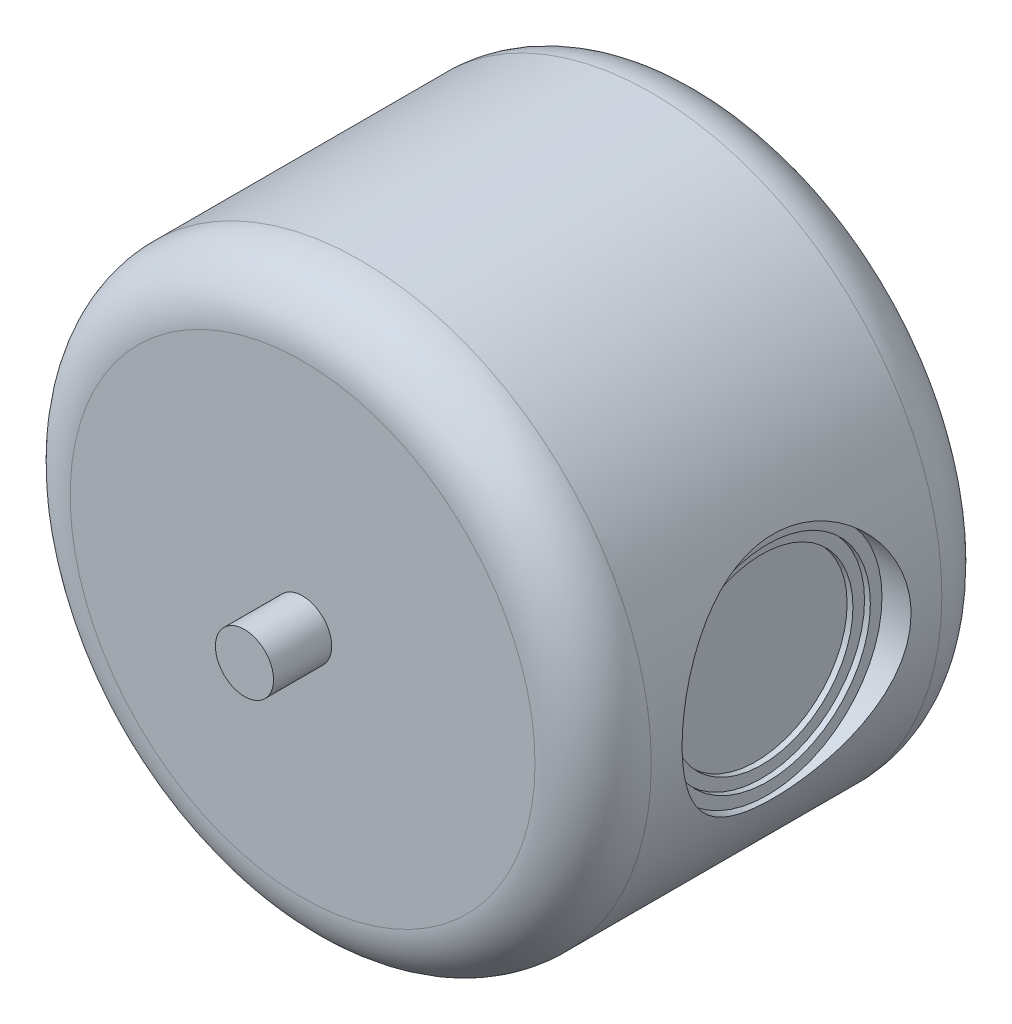
ISO-10303-21;
HEADER;
FILE_DESCRIPTION(('STEP AP214'),'2;1');
FILE_NAME('part.step','',(''),(''),'','','');
FILE_SCHEMA(('AUTOMOTIVE_DESIGN { 1 0 10303 214 1 1 1 1 }'));
ENDSEC;
DATA;
#1=APPLICATION_CONTEXT('core data for automotive mechanical design processes');
#2=APPLICATION_PROTOCOL_DEFINITION('international standard','automotive_design',2000,#1);
#3=PRODUCT_CONTEXT('',#1,'mechanical');
#4=PRODUCT('Part','Part','',(#3));
#5=PRODUCT_RELATED_PRODUCT_CATEGORY('part','',(#4));
#6=PRODUCT_DEFINITION_FORMATION('','',#4);
#7=PRODUCT_DEFINITION_CONTEXT('part definition',#1,'design');
#8=PRODUCT_DEFINITION('design','',#6,#7);
#9=PRODUCT_DEFINITION_SHAPE('','',#8);
#10=(LENGTH_UNIT() NAMED_UNIT(*) SI_UNIT(.MILLI.,.METRE.));
#11=(NAMED_UNIT(*) PLANE_ANGLE_UNIT() SI_UNIT($,.RADIAN.));
#12=(NAMED_UNIT(*) SI_UNIT($,.STERADIAN.) SOLID_ANGLE_UNIT());
#13=UNCERTAINTY_MEASURE_WITH_UNIT(LENGTH_MEASURE(1.E-05),#10,'distance_accuracy_value','');
#14=(GEOMETRIC_REPRESENTATION_CONTEXT(3) GLOBAL_UNCERTAINTY_ASSIGNED_CONTEXT((#13)) GLOBAL_UNIT_ASSIGNED_CONTEXT((#10,
#11,#12)) REPRESENTATION_CONTEXT('',''));
#15=CARTESIAN_POINT('',(0.,0.,0.));
#16=DIRECTION('',(0.,0.,1.));
#17=DIRECTION('',(1.,0.,0.));
#18=AXIS2_PLACEMENT_3D('',#15,#16,#17);
#19=CARTESIAN_POINT('',(0.,0.,35.));
#20=DIRECTION('',(0.,0.,-1.));
#21=DIRECTION('',(-1.,0.,0.));
#22=AXIS2_PLACEMENT_3D('',#19,#20,#21);
#23=CYLINDRICAL_SURFACE('',#22,50.);
#24=CARTESIAN_POINT('',(50.,0.,-19.6986749407736));
#25=CARTESIAN_POINT('',(49.9999971003142,-0.530341812364175,-19.6986712062474));
#26=CARTESIAN_POINT('',(49.9915390467,-1.0608558239034,-19.6772295321282));
#27=CARTESIAN_POINT('',(49.9579184736974,-2.11812855833135,-19.5916542851668));
#28=CARTESIAN_POINT('',(49.9327455892945,-2.64488474597198,-19.5274942222065));
#29=CARTESIAN_POINT('',(49.8662886059503,-3.69173698168736,-19.3569294462555));
#30=CARTESIAN_POINT('',(49.8249677655398,-4.21181502770552,-19.250428385085));
#31=CARTESIAN_POINT('',(49.7273209491464,-5.24026472533929,-18.9962625309519));
#32=CARTESIAN_POINT('',(49.6709972519594,-5.74863814205058,-18.8486039892738));
#33=CARTESIAN_POINT('',(49.5450034552983,-6.74876982958246,-18.5140240550183));
#34=CARTESIAN_POINT('',(49.4753759057558,-7.24057534471864,-18.3272276585705));
#35=CARTESIAN_POINT('',(49.3244103337893,-8.20617962272619,-17.9156880445921));
#36=CARTESIAN_POINT('',(49.2430718998238,-8.67997775204567,-17.690943493447));
#37=CARTESIAN_POINT('',(49.0707184975652,-9.60659157618023,-17.205368058511));
#38=CARTESIAN_POINT('',(48.979707543932,-10.059415865176,-16.9445521330052));
#39=CARTESIAN_POINT('',(48.7901612928664,-10.941839993678,-16.3885909837916));
#40=CARTESIAN_POINT('',(48.6916254436429,-11.371438126087,-16.0934432417437));
#41=CARTESIAN_POINT('',(48.4851315819626,-12.222591125716,-15.4576809004812));
#42=CARTESIAN_POINT('',(48.3769518485857,-12.6430576741457,-15.1156807719871));
#43=CARTESIAN_POINT('',(48.1577242912905,-13.4539977645802,-14.3986356713653));
#44=CARTESIAN_POINT('',(48.046676390386,-13.8444705003832,-14.023589811585));
#45=CARTESIAN_POINT('',(47.824522215283,-14.5934140546382,-13.2424678388343));
#46=CARTESIAN_POINT('',(47.7134159376835,-14.951870104409,-12.8363775643293));
#47=CARTESIAN_POINT('',(47.4941240667039,-15.6344720490248,-11.995594797163));
#48=CARTESIAN_POINT('',(47.3859384072652,-15.9586187203651,-11.560902952178));
#49=CARTESIAN_POINT('',(47.1708982574027,-16.5837357791074,-10.6460077473574));
#50=CARTESIAN_POINT('',(47.0643011096515,-16.8831099169071,-10.1646510863275));
#51=CARTESIAN_POINT('',(46.8607868888075,-17.4400286995964,-9.1763244113275));
#52=CARTESIAN_POINT('',(46.7638701640968,-17.6975718392676,-8.66935347653087));
#53=CARTESIAN_POINT('',(46.582928434274,-18.1685011463215,-7.63328392791221));
#54=CARTESIAN_POINT('',(46.498898797618,-18.3819031874169,-7.10419335117031));
#55=CARTESIAN_POINT('',(46.3466133150502,-18.7625564337549,-6.02745913997762));
#56=CARTESIAN_POINT('',(46.2783564344066,-18.9298106665473,-5.47981672527728));
#57=CARTESIAN_POINT('',(46.1627362034159,-19.2099905636879,-4.39476594304458));
#58=CARTESIAN_POINT('',(46.114581391821,-19.3249942999001,-3.85797851501253));
#59=CARTESIAN_POINT('',(46.0366533405109,-19.5099118713323,-2.77536456092594));
#60=CARTESIAN_POINT('',(46.0068795857849,-19.579826969874,-2.22953828856695));
#61=CARTESIAN_POINT('',(45.9668044724762,-19.6737262545245,-1.13345695290913));
#62=CARTESIAN_POINT('',(45.9564952031406,-19.6977291003353,-0.583203780143403));
#63=CARTESIAN_POINT('',(45.9557083117649,-19.6995657954276,0.517381379676178));
#64=CARTESIAN_POINT('',(45.9652298046566,-19.6774017051885,1.06771336211652));
#65=CARTESIAN_POINT('',(46.0024475670745,-19.5902228850341,2.12700039653985));
#66=CARTESIAN_POINT('',(46.0288783889412,-19.5281904109816,2.63624891416815));
#67=CARTESIAN_POINT('',(46.0978356299112,-19.364849636063,3.64727029005238));
#68=CARTESIAN_POINT('',(46.1403612174166,-19.2635433644223,4.14904353315514));
#69=CARTESIAN_POINT('',(46.2402074557677,-19.0226229572509,5.14184695632812));
#70=CARTESIAN_POINT('',(46.2975298873253,-18.8830042109151,5.63287583565779));
#71=CARTESIAN_POINT('',(46.4252765359078,-18.5667109950219,6.6010936217596));
#72=CARTESIAN_POINT('',(46.4957012187934,-18.3900352078444,7.07828203572577));
#73=CARTESIAN_POINT('',(46.6491939277827,-17.9971675494072,8.0254511698515));
#74=CARTESIAN_POINT('',(46.7324867975233,-17.7802555425085,8.49509646819908));
#75=CARTESIAN_POINT('',(46.9083321530407,-17.3110115515971,9.41451411995798));
#76=CARTESIAN_POINT('',(47.0008846825022,-17.0586794004791,9.86428637959904));
#77=CARTESIAN_POINT('',(47.1928210566419,-16.5202693492702,10.7416685498382));
#78=CARTESIAN_POINT('',(47.2922055140704,-16.2341884206258,11.1692764664851));
#79=CARTESIAN_POINT('',(47.4953467248358,-15.6298970137087,12.0003423736886));
#80=CARTESIAN_POINT('',(47.5991054819958,-15.3116717151605,12.4037890868335));
#81=CARTESIAN_POINT('',(47.8162883580864,-14.6199720176102,13.2135752274235));
#82=CARTESIAN_POINT('',(47.9298545288586,-14.2441449715664,13.6178699761265));
#83=CARTESIAN_POINT('',(48.1559658839886,-13.4599181895547,14.3934859726699));
#84=CARTESIAN_POINT('',(48.2685114564005,-13.0515314661315,14.7648202690766));
#85=CARTESIAN_POINT('',(48.4896778907751,-12.2042162813349,15.4725470674968));
#86=CARTESIAN_POINT('',(48.5982970946522,-11.7652751407103,15.8089249174491));
#87=CARTESIAN_POINT('',(48.8086716826133,-10.8595438337092,16.4442725064333));
#88=CARTESIAN_POINT('',(48.9104271031287,-10.3927538151732,16.7432424440254));
#89=CARTESIAN_POINT('',(49.1061627691352,-9.42512174274077,17.3067662635217));
#90=CARTESIAN_POINT('',(49.1999615941036,-8.92380551528519,17.5705702786421));
#91=CARTESIAN_POINT('',(49.3749402806024,-7.89846307105943,18.0547361382479));
#92=CARTESIAN_POINT('',(49.4561198716821,-7.37443636787461,18.2750970517042));
#93=CARTESIAN_POINT('',(49.6034648121665,-6.30762058052464,18.6701664527626));
#94=CARTESIAN_POINT('',(49.6696361345247,-5.76483905980996,18.8448931059835));
#95=CARTESIAN_POINT('',(49.7850224289563,-4.66448929993262,19.1469519092521));
#96=CARTESIAN_POINT('',(49.8342385353708,-4.10692205265634,19.2742872299294));
#97=CARTESIAN_POINT('',(49.9119021273533,-3.01406642085932,19.4741809754486));
#98=CARTESIAN_POINT('',(49.9413849967433,-2.47935132998096,19.5494784527472));
#99=CARTESIAN_POINT('',(49.983150226052,-1.40488096388091,19.655928281263));
#100=CARTESIAN_POINT('',(49.9954332480503,-0.865125883470404,19.6870823317086));
#101=CARTESIAN_POINT('',(50.0024541384016,0.215111840940588,19.7049049175064));
#102=CARTESIAN_POINT('',(49.9971958265025,0.755594300928556,19.6915831377804));
#103=CARTESIAN_POINT('',(49.9692897485836,1.83318181276395,19.6206212766602));
#104=CARTESIAN_POINT('',(49.9466422982295,2.37028692574204,19.5629819997632));
#105=CARTESIAN_POINT('',(49.8859399956658,3.41383295861385,19.4074642199769));
#106=CARTESIAN_POINT('',(49.8485962495933,3.92059324862875,19.3114400599354));
#107=CARTESIAN_POINT('',(49.7595187261819,4.92380786015839,19.0803265927783));
#108=CARTESIAN_POINT('',(49.707785471651,5.42026255539789,18.9452387049418));
#109=CARTESIAN_POINT('',(49.5911971114239,6.39972298113512,18.6371922918229));
#110=CARTESIAN_POINT('',(49.5263409644359,6.8827276409203,18.4642307612053));
#111=CARTESIAN_POINT('',(49.3850673602347,7.83234297506479,18.0818753851043));
#112=CARTESIAN_POINT('',(49.3086495046721,8.29895308388011,17.8724802842942));
#113=CARTESIAN_POINT('',(49.1435786790396,9.2269980791455,17.4119702981733));
#114=CARTESIAN_POINT('',(49.0546250137256,9.68784719529153,17.159783051596));
#115=CARTESIAN_POINT('',(48.8685135751975,10.586741059376,16.6202739168803));
#116=CARTESIAN_POINT('',(48.7713556890529,11.024785493276,16.3329515450858));
#117=CARTESIAN_POINT('',(48.5711458021579,11.875812827879,15.7250236598304));
#118=CARTESIAN_POINT('',(48.4680927950916,12.2887914248167,15.4044124562008));
#119=CARTESIAN_POINT('',(48.2585226651308,13.0876122144049,14.7317670640726));
#120=CARTESIAN_POINT('',(48.1520043154084,13.4734446402464,14.3797216683197));
#121=CARTESIAN_POINT('',(47.9312330789829,14.239586634069,13.6227815468132));
#122=CARTESIAN_POINT('',(47.8169211846484,14.6179651298838,13.2159468343959));
#123=CARTESIAN_POINT('',(47.5904262307825,15.3393054260359,12.3714156426352));
#124=CARTESIAN_POINT('',(47.4782432959115,15.682265157633,11.9337173631214));
#125=CARTESIAN_POINT('',(47.259149866388,16.3306437553929,11.029837253956));
#126=CARTESIAN_POINT('',(47.1522412656673,16.6360491943015,10.5636453252873));
#127=CARTESIAN_POINT('',(46.9469464789016,17.2068653642817,9.60584430459624));
#128=CARTESIAN_POINT('',(46.848556879854,17.4722921439841,9.11424551866274));
#129=CARTESIAN_POINT('',(46.6625308246448,17.9632335628852,8.10419569125817));
#130=CARTESIAN_POINT('',(46.5749929374647,18.1883895622352,7.58555183639122));
#131=CARTESIAN_POINT('',(46.4145961555742,18.5938931336209,6.52879750640907));
#132=CARTESIAN_POINT('',(46.3417374434017,18.7742401484562,5.99068678931843));
#133=CARTESIAN_POINT('',(46.2133298173799,19.0881359563757,4.89929271111177));
#134=CARTESIAN_POINT('',(46.157770669771,19.2217124229699,4.34601853170675));
#135=CARTESIAN_POINT('',(46.0659859274977,19.4406558327127,3.22844241033681));
#136=CARTESIAN_POINT('',(46.0297587826806,19.5260266413041,2.6641413563336));
#137=CARTESIAN_POINT('',(45.9798500012803,19.643246011353,1.56916146659856));
#138=CARTESIAN_POINT('',(45.9647649934982,19.6784292332724,1.03890117492328));
#139=CARTESIAN_POINT('',(45.9530300121096,19.7058183960568,-0.0229206808321403));
#140=CARTESIAN_POINT('',(45.9563791385847,19.6980264348862,-0.554482180123571));
#141=CARTESIAN_POINT('',(45.9813951438519,19.639559408626,-1.61473834632656));
#142=CARTESIAN_POINT('',(46.0030600021107,19.5888890737416,-2.14343332298938));
#143=CARTESIAN_POINT('',(46.0639650042077,19.4452358238947,-3.19400718392662));
#144=CARTESIAN_POINT('',(46.1032050858888,19.3522530585755,-3.71588609230023));
#145=CARTESIAN_POINT('',(46.1961836702768,19.1292082017443,-4.72974610696686));
#146=CARTESIAN_POINT('',(46.249326631914,19.0006589282031,-5.22211623564366));
#147=CARTESIAN_POINT('',(46.3691093643727,18.7064400534139,-6.19391915671075));
#148=CARTESIAN_POINT('',(46.4357486879365,18.5407716822411,-6.67335237722245));
#149=CARTESIAN_POINT('',(46.5806429953278,18.1736788546125,-7.6165146434164));
#150=CARTESIAN_POINT('',(46.658898410175,17.9722530713093,-8.08024310558286));
#151=CARTESIAN_POINT('',(46.8249484264572,17.5350754769258,-8.98963671553267));
#152=CARTESIAN_POINT('',(46.9127464871399,17.2993112074028,-9.43529523196516));
#153=CARTESIAN_POINT('',(47.1007379265151,16.7809612500407,-10.3305085310959));
#154=CARTESIAN_POINT('',(47.2013499679759,16.4964940363501,-10.7788864340136));
#155=CARTESIAN_POINT('',(47.4079634923561,15.8929765762561,-11.650410726754));
#156=CARTESIAN_POINT('',(47.5139651507226,15.5739252036593,-12.0735562942188));
#157=CARTESIAN_POINT('',(47.7286568654881,14.9029996982747,-12.8925853032732));
#158=CARTESIAN_POINT('',(47.8373481570403,14.551110271807,-13.288455891376));
#159=CARTESIAN_POINT('',(48.0546035508852,13.8167165337457,-14.0504830060357));
#160=CARTESIAN_POINT('',(48.1631676818311,13.4342215779767,-14.4166485447415));
#161=CARTESIAN_POINT('',(48.3842330013098,12.6157318612618,-15.1392678526313));
#162=CARTESIAN_POINT('',(48.4965562829654,12.1778875458526,-15.4936849106495));
#163=CARTESIAN_POINT('',(48.7149846505714,11.2724068941825,-16.1644083415632));
#164=CARTESIAN_POINT('',(48.8210893058102,10.8047684990079,-16.4807120762688));
#165=CARTESIAN_POINT('',(49.0241506647629,9.84248350040878,-17.0728594561897));
#166=CARTESIAN_POINT('',(49.1211053034723,9.34783083989519,-17.348693975938));
#167=CARTESIAN_POINT('',(49.3030888976102,8.33487245739627,-17.857458637062));
#168=CARTESIAN_POINT('',(49.3881194524234,7.81656991996791,-18.0903945337721));
#169=CARTESIAN_POINT('',(49.5371752857876,6.80492511364858,-18.4932821328028));
#170=CARTESIAN_POINT('',(49.6023727164677,6.3132161098645,-18.6669082781989));
#171=CARTESIAN_POINT('',(49.7191312685274,5.31600768816225,-18.974987682761));
#172=CARTESIAN_POINT('',(49.7706911033872,4.81050697414436,-19.1094372462764));
#173=CARTESIAN_POINT('',(49.8587407297636,3.79044145958698,-19.3376024987486));
#174=CARTESIAN_POINT('',(49.8952674862134,3.27590217543894,-19.431418132889));
#175=CARTESIAN_POINT('',(49.9524722302729,2.24033511207484,-19.5778410772857));
#176=CARTESIAN_POINT('',(49.973159602759,1.71931136120456,-19.6304727895304));
#177=CARTESIAN_POINT('',(49.9904419579269,0.997761605870039,-19.6744035632061));
#178=CARTESIAN_POINT('',(49.9940241656689,0.798348142149048,-19.683502703175));
#179=CARTESIAN_POINT('',(49.9988037965868,0.399297928749915,-19.6956392577429));
#180=CARTESIAN_POINT('',(50.0000010916632,0.199661167654148,-19.6986763467345));
#181=CARTESIAN_POINT('',(50.,0.,-19.6986749407736));
#182=B_SPLINE_CURVE_WITH_KNOTS('',3,(#24,#25,#26,#27,#28,#29,#30,#31,#32,#33,#34,#35,#36,#37,
#38,#39,#40,#41,#42,#43,#44,#45,#46,#47,#48,#49,#50,#51,#52,#53,#54,#55,#56,#57,#58,#59,#60,#61,
#62,#63,#64,#65,#66,#67,#68,#69,#70,#71,#72,#73,#74,#75,#76,#77,#78,#79,#80,#81,#82,#83,#84,#85,
#86,#87,#88,#89,#90,#91,#92,#93,#94,#95,#96,#97,#98,#99,#100,#101,#102,#103,#104,#105,#106,#107,
#108,#109,#110,#111,#112,#113,#114,#115,#116,#117,#118,#119,#120,#121,#122,#123,#124,#125,#126,
#127,#128,#129,#130,#131,#132,#133,#134,#135,#136,#137,#138,#139,#140,#141,#142,#143,#144,#145,
#146,#147,#148,#149,#150,#151,#152,#153,#154,#155,#156,#157,#158,#159,#160,#161,#162,#163,#164,
#165,#166,#167,#168,#169,#170,#171,#172,#173,#174,#175,#176,#177,#178,#179,#180,#181),
.UNSPECIFIED.,.T.,.F.,(4,2,2,2,2,2,2,2,2,2,2,2,2,2,2,2,2,2,2,2,2,2,2,2,2,2,2,2,2,2,2,2,2,2,2,2,
2,2,2,2,2,2,2,2,2,2,2,2,2,2,2,2,2,2,2,2,2,2,2,2,2,2,2,2,2,2,2,2,2,2,2,2,2,2,2,2,2,2,4),(0.,
1.59082576719709,3.18263894195755,4.77809525889985,6.3733093787617,7.96350440817803,
9.55375533355809,11.1433487708817,12.7330588831981,14.3892730803982,16.0455317793031,
17.7025505748323,19.3595318604257,21.0877737981831,22.8160779100601,24.5437594165897,
26.2713275507511,27.9223840463526,29.5733942796087,31.223733364997,32.8739987955723,
34.413272646774,35.9524669763257,37.4918466251541,39.0312810182769,40.6015270757691,
42.1717805416229,43.7421750264958,45.3132968810332,47.0020412233812,48.690114006394,
50.3788915184293,52.0676600660965,53.7880730033844,55.508522806832,57.2282867038088,
58.9479355224671,60.5682592583859,62.1885206209221,63.808429183278,65.4283083400692,
66.977906460725,68.5274482878328,70.0771131181975,71.6268313531901,73.2235324966827,
74.8202556221975,76.4172521315463,78.0148203101858,79.7145525124576,81.4143839366565,
83.114821366414,84.8145743599045,86.528783272103,88.2430134994502,89.9562277187843,
91.6693045419633,93.2622013358837,94.8550203683865,96.4476637090867,98.0403014172444,
99.5735195150656,101.106686811682,102.639911011308,104.173692876444,105.793282675105,
107.412925229701,109.033325901912,110.653233111403,112.374366752086,114.095619460636,
115.817259702602,117.538668798564,119.113481754018,120.688443218493,122.259508523094,
123.829642245507,124.428518411244,125.027426743206),.UNSPECIFIED.);
#183=CARTESIAN_POINT('',(50.,0.,-19.6986749407736));
#184=VERTEX_POINT('',#183);
#185=EDGE_CURVE('E10',#184,#184,#182,.T.);
#186=ORIENTED_EDGE('',*,*,#185,.T.);
#187=EDGE_LOOP('',(#186));
#188=FACE_BOUND('',#187,.T.);
#189=CARTESIAN_POINT('',(0.,0.,-25.));
#190=DIRECTION('',(0.,0.,1.));
#191=DIRECTION('',(1.,0.,0.));
#192=AXIS2_PLACEMENT_3D('',#189,#190,#191);
#193=CIRCLE('',#192,50.);
#194=CARTESIAN_POINT('',(50.,0.,-25.));
#195=VERTEX_POINT('',#194);
#196=EDGE_CURVE('E58',#195,#195,#193,.T.);
#197=ORIENTED_EDGE('',*,*,#196,.T.);
#198=EDGE_LOOP('',(#197));
#199=FACE_BOUND('',#198,.T.);
#200=CARTESIAN_POINT('',(0.,0.,25.));
#201=DIRECTION('',(0.,0.,1.));
#202=DIRECTION('',(1.,0.,0.));
#203=AXIS2_PLACEMENT_3D('',#200,#201,#202);
#204=CIRCLE('',#203,50.);
#205=CARTESIAN_POINT('',(50.,0.,25.));
#206=VERTEX_POINT('',#205);
#207=EDGE_CURVE('E63',#206,#206,#204,.F.);
#208=ORIENTED_EDGE('',*,*,#207,.T.);
#209=EDGE_LOOP('',(#208));
#210=FACE_BOUND('',#209,.T.);
#211=ADVANCED_FACE('F38',(#188,#199,#210),#23,.T.);
#212=CARTESIAN_POINT('',(0.,0.,35.));
#213=DIRECTION('',(0.,0.,1.));
#214=DIRECTION('',(1.,0.,0.));
#215=AXIS2_PLACEMENT_3D('',#212,#213,#214);
#216=PLANE('',#215);
#217=CARTESIAN_POINT('',(0.,0.,35.));
#218=DIRECTION('',(0.,0.,1.));
#219=DIRECTION('',(1.,0.,0.));
#220=AXIS2_PLACEMENT_3D('',#217,#218,#219);
#221=CIRCLE('',#220,40.);
#222=CARTESIAN_POINT('',(40.,0.,35.));
#223=VERTEX_POINT('',#222);
#224=EDGE_CURVE('E50',#223,#223,#221,.T.);
#225=ORIENTED_EDGE('',*,*,#224,.T.);
#226=EDGE_LOOP('',(#225));
#227=FACE_BOUND('',#226,.T.);
#228=CARTESIAN_POINT('',(0.,0.,35.));
#229=DIRECTION('',(0.,0.,1.));
#230=DIRECTION('',(1.,0.,0.));
#231=AXIS2_PLACEMENT_3D('',#228,#229,#230);
#232=CIRCLE('',#231,5.);
#233=CARTESIAN_POINT('',(-5.,0.,35.));
#234=VERTEX_POINT('',#233);
#235=EDGE_CURVE('E69',#234,#234,#232,.F.);
#236=ORIENTED_EDGE('',*,*,#235,.T.);
#237=EDGE_LOOP('',(#236));
#238=FACE_BOUND('',#237,.T.);
#239=ADVANCED_FACE('F131',(#227,#238),#216,.T.);
#240=CARTESIAN_POINT('',(0.,0.,-35.));
#241=DIRECTION('',(0.,0.,1.));
#242=DIRECTION('',(1.,0.,0.));
#243=AXIS2_PLACEMENT_3D('',#240,#241,#242);
#244=PLANE('',#243);
#245=CARTESIAN_POINT('',(0.,0.,-35.));
#246=DIRECTION('',(0.,0.,1.));
#247=DIRECTION('',(1.,0.,0.));
#248=AXIS2_PLACEMENT_3D('',#245,#246,#247);
#249=CIRCLE('',#248,40.);
#250=CARTESIAN_POINT('',(40.,0.,-35.));
#251=VERTEX_POINT('',#250);
#252=EDGE_CURVE('E54',#251,#251,#249,.F.);
#253=ORIENTED_EDGE('',*,*,#252,.T.);
#254=EDGE_LOOP('',(#253));
#255=FACE_BOUND('',#254,.T.);
#256=CARTESIAN_POINT('',(0.,0.,-35.));
#257=DIRECTION('',(0.,0.,1.));
#258=DIRECTION('',(1.,0.,0.));
#259=AXIS2_PLACEMENT_3D('',#256,#257,#258);
#260=CIRCLE('',#259,5.);
#261=CARTESIAN_POINT('',(-5.,0.,-35.));
#262=VERTEX_POINT('',#261);
#263=EDGE_CURVE('E66',#262,#262,#260,.F.);
#264=ORIENTED_EDGE('',*,*,#263,.F.);
#265=EDGE_LOOP('',(#264));
#266=FACE_BOUND('',#265,.T.);
#267=ADVANCED_FACE('F135',(#255,#266),#244,.F.);
#268=CARTESIAN_POINT('',(0.,0.,-45.));
#269=DIRECTION('',(0.,0.,1.));
#270=DIRECTION('',(1.,0.,0.));
#271=AXIS2_PLACEMENT_3D('',#268,#269,#270);
#272=PLANE('',#271);
#273=CARTESIAN_POINT('',(0.,0.,-45.));
#274=DIRECTION('',(0.,0.,1.));
#275=DIRECTION('',(1.,0.,0.));
#276=AXIS2_PLACEMENT_3D('',#273,#274,#275);
#277=CIRCLE('',#276,5.);
#278=CARTESIAN_POINT('',(-5.,0.,-45.));
#279=VERTEX_POINT('',#278);
#280=EDGE_CURVE('E73',#279,#279,#277,.T.);
#281=ORIENTED_EDGE('',*,*,#280,.F.);
#282=EDGE_LOOP('',(#281));
#283=FACE_BOUND('',#282,.T.);
#284=ADVANCED_FACE('F157',(#283),#272,.F.);
#285=CARTESIAN_POINT('',(0.,0.,45.));
#286=DIRECTION('',(0.,0.,-1.));
#287=DIRECTION('',(-1.,0.,0.));
#288=AXIS2_PLACEMENT_3D('',#285,#286,#287);
#289=CYLINDRICAL_SURFACE('',#288,5.);
#290=CARTESIAN_POINT('',(-5.,0.,-45.));
#291=CARTESIAN_POINT('',(-5.,0.,-44.8958333333333));
#292=CARTESIAN_POINT('',(-5.,0.,-44.7916666666667));
#293=CARTESIAN_POINT('',(-5.,0.,-44.5833333333333));
#294=CARTESIAN_POINT('',(-5.,0.,-44.4791666666667));
#295=CARTESIAN_POINT('',(-5.,0.,-44.2708333333333));
#296=CARTESIAN_POINT('',(-5.,0.,-44.1666666666667));
#297=CARTESIAN_POINT('',(-5.,0.,-43.9583333333333));
#298=CARTESIAN_POINT('',(-5.,0.,-43.8541666666667));
#299=CARTESIAN_POINT('',(-5.,0.,-43.6458333333333));
#300=CARTESIAN_POINT('',(-5.,0.,-43.5416666666667));
#301=CARTESIAN_POINT('',(-5.,0.,-43.3333333333333));
#302=CARTESIAN_POINT('',(-5.,0.,-43.2291666666667));
#303=CARTESIAN_POINT('',(-5.,0.,-43.0208333333333));
#304=CARTESIAN_POINT('',(-5.,0.,-42.9166666666667));
#305=CARTESIAN_POINT('',(-5.,0.,-42.7083333333333));
#306=CARTESIAN_POINT('',(-5.,0.,-42.6041666666667));
#307=CARTESIAN_POINT('',(-5.,0.,-42.3958333333333));
#308=CARTESIAN_POINT('',(-5.,0.,-42.2916666666667));
#309=CARTESIAN_POINT('',(-5.,0.,-42.0833333333333));
#310=CARTESIAN_POINT('',(-5.,0.,-41.9791666666667));
#311=CARTESIAN_POINT('',(-5.,0.,-41.7708333333333));
#312=CARTESIAN_POINT('',(-5.,0.,-41.6666666666667));
#313=CARTESIAN_POINT('',(-5.,0.,-41.4583333333333));
#314=CARTESIAN_POINT('',(-5.,0.,-41.3541666666667));
#315=CARTESIAN_POINT('',(-5.,0.,-41.1458333333333));
#316=CARTESIAN_POINT('',(-5.,0.,-41.0416666666667));
#317=CARTESIAN_POINT('',(-5.,0.,-40.8333333333333));
#318=CARTESIAN_POINT('',(-5.,0.,-40.7291666666667));
#319=CARTESIAN_POINT('',(-5.,0.,-40.5208333333333));
#320=CARTESIAN_POINT('',(-5.,0.,-40.4166666666667));
#321=CARTESIAN_POINT('',(-5.,0.,-40.2083333333333));
#322=CARTESIAN_POINT('',(-5.,0.,-40.1041666666667));
#323=CARTESIAN_POINT('',(-5.,0.,-39.8958333333333));
#324=CARTESIAN_POINT('',(-5.,0.,-39.7916666666667));
#325=CARTESIAN_POINT('',(-5.,0.,-39.5833333333333));
#326=CARTESIAN_POINT('',(-5.,0.,-39.4791666666667));
#327=CARTESIAN_POINT('',(-5.,0.,-39.2708333333333));
#328=CARTESIAN_POINT('',(-5.,0.,-39.1666666666667));
#329=CARTESIAN_POINT('',(-5.,0.,-38.9583333333333));
#330=CARTESIAN_POINT('',(-5.,0.,-38.8541666666667));
#331=CARTESIAN_POINT('',(-5.,0.,-38.6458333333333));
#332=CARTESIAN_POINT('',(-5.,0.,-38.5416666666667));
#333=CARTESIAN_POINT('',(-5.,0.,-38.3333333333333));
#334=CARTESIAN_POINT('',(-5.,0.,-38.2291666666667));
#335=CARTESIAN_POINT('',(-5.,0.,-38.0208333333333));
#336=CARTESIAN_POINT('',(-5.,0.,-37.9166666666667));
#337=CARTESIAN_POINT('',(-5.,0.,-37.7083333333333));
#338=CARTESIAN_POINT('',(-5.,0.,-37.6041666666667));
#339=CARTESIAN_POINT('',(-5.,0.,-37.3958333333333));
#340=CARTESIAN_POINT('',(-5.,0.,-37.2916666666667));
#341=CARTESIAN_POINT('',(-5.,0.,-37.0833333333333));
#342=CARTESIAN_POINT('',(-5.,0.,-36.9791666666667));
#343=CARTESIAN_POINT('',(-5.,0.,-36.7708333333333));
#344=CARTESIAN_POINT('',(-5.,0.,-36.6666666666667));
#345=CARTESIAN_POINT('',(-5.,0.,-36.4583333333333));
#346=CARTESIAN_POINT('',(-5.,0.,-36.3541666666667));
#347=CARTESIAN_POINT('',(-5.,0.,-36.1458333333333));
#348=CARTESIAN_POINT('',(-5.,0.,-36.0416666666667));
#349=CARTESIAN_POINT('',(-5.,0.,-35.8333333333333));
#350=CARTESIAN_POINT('',(-5.,0.,-35.7291666666667));
#351=CARTESIAN_POINT('',(-5.,0.,-35.5208333333333));
#352=CARTESIAN_POINT('',(-5.,0.,-35.4166666666667));
#353=CARTESIAN_POINT('',(-5.,0.,-35.2083333333333));
#354=CARTESIAN_POINT('',(-5.,0.,-35.1041666666667));
#355=CARTESIAN_POINT('',(-5.,0.,-35.));
#356=B_SPLINE_CURVE_WITH_KNOTS('',3,(#290,#291,#292,#293,#294,#295,#296,#297,#298,#299,#300,
#301,#302,#303,#304,#305,#306,#307,#308,#309,#310,#311,#312,#313,#314,#315,#316,#317,#318,#319,
#320,#321,#322,#323,#324,#325,#326,#327,#328,#329,#330,#331,#332,#333,#334,#335,#336,#337,#338,
#339,#340,#341,#342,#343,#344,#345,#346,#347,#348,#349,#350,#351,#352,#353,#354,#355),
.UNSPECIFIED.,.F.,.F.,(4,2,2,2,2,2,2,2,2,2,2,2,2,2,2,2,2,2,2,2,2,2,2,2,2,2,2,2,2,2,2,2,4),(0.,
0.312499999999993,0.625000000000001,0.937500000000008,1.25,1.56249999999999,1.875,
2.18750000000001,2.5,2.8125,3.125,3.43750000000001,3.75,4.0625,4.375,4.68750000000001,5.,5.3125,
5.62500000000001,5.93750000000001,6.25000000000001,6.5625,6.87500000000001,7.18750000000001,
7.50000000000001,7.8125,8.12500000000001,8.43750000000001,8.75000000000001,9.0625,
9.37500000000001,9.68750000000002,10.),.UNSPECIFIED.);
#357=EDGE_CURVE('BSEAM160',#279,#262,#356,.T.);
#358=ORIENTED_EDGE('',*,*,#280,.T.);
#359=ORIENTED_EDGE('',*,*,#263,.T.);
#360=ORIENTED_EDGE('',*,*,#357,.T.);
#361=ORIENTED_EDGE('',*,*,#357,.F.);
#362=EDGE_LOOP('',(#358,#360,#359,#361));
#363=FACE_BOUND('',#362,.T.);
#364=ADVANCED_FACE('F160',(#363),#289,.T.);
#365=CARTESIAN_POINT('',(0.,0.,45.));
#366=DIRECTION('',(0.,0.,1.));
#367=DIRECTION('',(1.,0.,0.));
#368=AXIS2_PLACEMENT_3D('',#365,#366,#367);
#369=CIRCLE('',#368,5.);
#370=CARTESIAN_POINT('',(-5.,0.,45.));
#371=VERTEX_POINT('',#370);
#372=EDGE_CURVE('E72',#371,#371,#369,.T.);
#373=CARTESIAN_POINT('',(-5.,0.,35.));
#374=CARTESIAN_POINT('',(-5.,0.,35.1041666666667));
#375=CARTESIAN_POINT('',(-5.,0.,35.2083333333333));
#376=CARTESIAN_POINT('',(-5.,0.,35.4166666666667));
#377=CARTESIAN_POINT('',(-5.,0.,35.5208333333333));
#378=CARTESIAN_POINT('',(-5.,0.,35.7291666666667));
#379=CARTESIAN_POINT('',(-5.,0.,35.8333333333333));
#380=CARTESIAN_POINT('',(-5.,0.,36.0416666666667));
#381=CARTESIAN_POINT('',(-5.,0.,36.1458333333333));
#382=CARTESIAN_POINT('',(-5.,0.,36.3541666666667));
#383=CARTESIAN_POINT('',(-5.,0.,36.4583333333333));
#384=CARTESIAN_POINT('',(-5.,0.,36.6666666666667));
#385=CARTESIAN_POINT('',(-5.,0.,36.7708333333333));
#386=CARTESIAN_POINT('',(-5.,0.,36.9791666666667));
#387=CARTESIAN_POINT('',(-5.,0.,37.0833333333333));
#388=CARTESIAN_POINT('',(-5.,0.,37.2916666666667));
#389=CARTESIAN_POINT('',(-5.,0.,37.3958333333333));
#390=CARTESIAN_POINT('',(-5.,0.,37.6041666666667));
#391=CARTESIAN_POINT('',(-5.,0.,37.7083333333333));
#392=CARTESIAN_POINT('',(-5.,0.,37.9166666666667));
#393=CARTESIAN_POINT('',(-5.,0.,38.0208333333333));
#394=CARTESIAN_POINT('',(-5.,0.,38.2291666666667));
#395=CARTESIAN_POINT('',(-5.,0.,38.3333333333333));
#396=CARTESIAN_POINT('',(-5.,0.,38.5416666666667));
#397=CARTESIAN_POINT('',(-5.,0.,38.6458333333333));
#398=CARTESIAN_POINT('',(-5.,0.,38.8541666666667));
#399=CARTESIAN_POINT('',(-5.,0.,38.9583333333333));
#400=CARTESIAN_POINT('',(-5.,0.,39.1666666666667));
#401=CARTESIAN_POINT('',(-5.,0.,39.2708333333333));
#402=CARTESIAN_POINT('',(-5.,0.,39.4791666666667));
#403=CARTESIAN_POINT('',(-5.,0.,39.5833333333333));
#404=CARTESIAN_POINT('',(-5.,0.,39.7916666666667));
#405=CARTESIAN_POINT('',(-5.,0.,39.8958333333333));
#406=CARTESIAN_POINT('',(-5.,0.,40.1041666666667));
#407=CARTESIAN_POINT('',(-5.,0.,40.2083333333333));
#408=CARTESIAN_POINT('',(-5.,0.,40.4166666666667));
#409=CARTESIAN_POINT('',(-5.,0.,40.5208333333333));
#410=CARTESIAN_POINT('',(-5.,0.,40.7291666666667));
#411=CARTESIAN_POINT('',(-5.,0.,40.8333333333333));
#412=CARTESIAN_POINT('',(-5.,0.,41.0416666666667));
#413=CARTESIAN_POINT('',(-5.,0.,41.1458333333333));
#414=CARTESIAN_POINT('',(-5.,0.,41.3541666666667));
#415=CARTESIAN_POINT('',(-5.,0.,41.4583333333333));
#416=CARTESIAN_POINT('',(-5.,0.,41.6666666666667));
#417=CARTESIAN_POINT('',(-5.,0.,41.7708333333333));
#418=CARTESIAN_POINT('',(-5.,0.,41.9791666666667));
#419=CARTESIAN_POINT('',(-5.,0.,42.0833333333333));
#420=CARTESIAN_POINT('',(-5.,0.,42.2916666666667));
#421=CARTESIAN_POINT('',(-5.,0.,42.3958333333333));
#422=CARTESIAN_POINT('',(-5.,0.,42.6041666666667));
#423=CARTESIAN_POINT('',(-5.,0.,42.7083333333333));
#424=CARTESIAN_POINT('',(-5.,0.,42.9166666666667));
#425=CARTESIAN_POINT('',(-5.,0.,43.0208333333333));
#426=CARTESIAN_POINT('',(-5.,0.,43.2291666666667));
#427=CARTESIAN_POINT('',(-5.,0.,43.3333333333333));
#428=CARTESIAN_POINT('',(-5.,0.,43.5416666666667));
#429=CARTESIAN_POINT('',(-5.,0.,43.6458333333333));
#430=CARTESIAN_POINT('',(-5.,0.,43.8541666666667));
#431=CARTESIAN_POINT('',(-5.,0.,43.9583333333333));
#432=CARTESIAN_POINT('',(-5.,0.,44.1666666666667));
#433=CARTESIAN_POINT('',(-5.,0.,44.2708333333333));
#434=CARTESIAN_POINT('',(-5.,0.,44.4791666666667));
#435=CARTESIAN_POINT('',(-5.,0.,44.5833333333333));
#436=CARTESIAN_POINT('',(-5.,0.,44.7916666666667));
#437=CARTESIAN_POINT('',(-5.,0.,44.8958333333333));
#438=CARTESIAN_POINT('',(-5.,0.,45.));
#439=B_SPLINE_CURVE_WITH_KNOTS('',3,(#373,#374,#375,#376,#377,#378,#379,#380,#381,#382,#383,
#384,#385,#386,#387,#388,#389,#390,#391,#392,#393,#394,#395,#396,#397,#398,#399,#400,#401,#402,
#403,#404,#405,#406,#407,#408,#409,#410,#411,#412,#413,#414,#415,#416,#417,#418,#419,#420,#421,
#422,#423,#424,#425,#426,#427,#428,#429,#430,#431,#432,#433,#434,#435,#436,#437,#438),
.UNSPECIFIED.,.F.,.F.,(4,2,2,2,2,2,2,2,2,2,2,2,2,2,2,2,2,2,2,2,2,2,2,2,2,2,2,2,2,2,2,2,4),(0.,
0.3125,0.625000000000001,0.937500000000001,1.25,1.5625,1.875,2.1875,2.5,2.8125,3.125,3.4375,
3.75,4.0625,4.375,4.6875,5.,5.3125,5.625,5.9375,6.25,6.5625,6.875,7.1875,7.5,7.8125,8.125,
8.4375,8.75,9.0625,9.375,9.6875,10.),.UNSPECIFIED.);
#440=EDGE_CURVE('BSEAM146',#234,#371,#439,.T.);
#441=ORIENTED_EDGE('',*,*,#235,.F.);
#442=ORIENTED_EDGE('',*,*,#372,.F.);
#443=ORIENTED_EDGE('',*,*,#440,.T.);
#444=ORIENTED_EDGE('',*,*,#440,.F.);
#445=EDGE_LOOP('',(#441,#443,#442,#444));
#446=FACE_BOUND('',#445,.T.);
#447=ADVANCED_FACE('F146',(#446),#289,.T.);
#448=CARTESIAN_POINT('',(0.,0.,45.));
#449=DIRECTION('',(0.,0.,1.));
#450=DIRECTION('',(1.,0.,0.));
#451=AXIS2_PLACEMENT_3D('',#448,#449,#450);
#452=PLANE('',#451);
#453=ORIENTED_EDGE('',*,*,#372,.T.);
#454=EDGE_LOOP('',(#453));
#455=FACE_BOUND('',#454,.T.);
#456=ADVANCED_FACE('F141',(#455),#452,.T.);
#457=CARTESIAN_POINT('',(0.,0.,-25.));
#458=DIRECTION('',(0.,0.,1.));
#459=DIRECTION('',(1.,0.,0.));
#460=AXIS2_PLACEMENT_3D('',#457,#458,#459);
#461=TOROIDAL_SURFACE('',#460,40.,10.);
#462=ORIENTED_EDGE('',*,*,#252,.F.);
#463=EDGE_LOOP('',(#462));
#464=FACE_BOUND('',#463,.T.);
#465=ORIENTED_EDGE('',*,*,#196,.F.);
#466=EDGE_LOOP('',(#465));
#467=FACE_BOUND('',#466,.T.);
#468=ADVANCED_FACE('F126',(#464,#467),#461,.T.);
#469=CARTESIAN_POINT('',(0.,0.,25.));
#470=DIRECTION('',(0.,0.,1.));
#471=DIRECTION('',(1.,0.,0.));
#472=AXIS2_PLACEMENT_3D('',#469,#470,#471);
#473=TOROIDAL_SURFACE('',#472,40.,10.);
#474=ORIENTED_EDGE('',*,*,#207,.F.);
#475=EDGE_LOOP('',(#474));
#476=FACE_BOUND('',#475,.T.);
#477=ORIENTED_EDGE('',*,*,#224,.F.);
#478=EDGE_LOOP('',(#477));
#479=FACE_BOUND('',#478,.T.);
#480=ADVANCED_FACE('F40',(#476,#479),#473,.T.);
#481=CARTESIAN_POINT('',(45.,0.,0.));
#482=DIRECTION('',(1.,0.,0.));
#483=DIRECTION('',(0.,0.,-1.));
#484=AXIS2_PLACEMENT_3D('',#481,#482,#483);
#485=CYLINDRICAL_SURFACE('',#484,19.6986749407736);
#486=CARTESIAN_POINT('',(45.,0.,0.));
#487=DIRECTION('',(1.,0.,0.));
#488=DIRECTION('',(0.,0.,-1.));
#489=AXIS2_PLACEMENT_3D('',#486,#487,#488);
#490=CIRCLE('',#489,19.6986749407736);
#491=CARTESIAN_POINT('',(45.,0.,-19.6986749407736));
#492=VERTEX_POINT('',#491);
#493=EDGE_CURVE('E76',#492,#492,#490,.T.);
#494=ORIENTED_EDGE('',*,*,#493,.F.);
#495=EDGE_LOOP('',(#494));
#496=FACE_BOUND('',#495,.T.);
#497=ORIENTED_EDGE('',*,*,#185,.F.);
#498=EDGE_LOOP('',(#497));
#499=FACE_BOUND('',#498,.T.);
#500=ADVANCED_FACE('F117',(#496,#499),#485,.F.);
#501=CARTESIAN_POINT('',(45.,0.,0.));
#502=DIRECTION('',(1.,0.,0.));
#503=DIRECTION('',(0.,0.,-1.));
#504=AXIS2_PLACEMENT_3D('',#501,#502,#503);
#505=PLANE('',#504);
#506=CARTESIAN_POINT('',(45.,0.,0.));
#507=DIRECTION('',(1.,0.,0.));
#508=DIRECTION('',(0.,0.,-1.));
#509=AXIS2_PLACEMENT_3D('',#506,#507,#508);
#510=CIRCLE('',#509,17.6986749407736);
#511=CARTESIAN_POINT('',(45.,0.,-17.6986749407736));
#512=VERTEX_POINT('',#511);
#513=EDGE_CURVE('E82',#512,#512,#510,.T.);
#514=ORIENTED_EDGE('',*,*,#513,.F.);
#515=EDGE_LOOP('',(#514));
#516=FACE_BOUND('',#515,.T.);
#517=ORIENTED_EDGE('',*,*,#493,.T.);
#518=EDGE_LOOP('',(#517));
#519=FACE_BOUND('',#518,.T.);
#520=ADVANCED_FACE('F111',(#516,#519),#505,.T.);
#521=CARTESIAN_POINT('',(44.,0.,0.));
#522=DIRECTION('',(1.,0.,0.));
#523=DIRECTION('',(0.,0.,-1.));
#524=AXIS2_PLACEMENT_3D('',#521,#522,#523);
#525=CYLINDRICAL_SURFACE('',#524,17.6986749407736);
#526=CARTESIAN_POINT('',(44.,0.,0.));
#527=DIRECTION('',(1.,0.,0.));
#528=DIRECTION('',(0.,0.,-1.));
#529=AXIS2_PLACEMENT_3D('',#526,#527,#528);
#530=CIRCLE('',#529,17.6986749407736);
#531=CARTESIAN_POINT('',(44.,0.,-17.6986749407736));
#532=VERTEX_POINT('',#531);
#533=EDGE_CURVE('E81',#532,#532,#530,.T.);
#534=ORIENTED_EDGE('',*,*,#533,.F.);
#535=EDGE_LOOP('',(#534));
#536=FACE_BOUND('',#535,.T.);
#537=ORIENTED_EDGE('',*,*,#513,.T.);
#538=EDGE_LOOP('',(#537));
#539=FACE_BOUND('',#538,.T.);
#540=ADVANCED_FACE('F105',(#536,#539),#525,.F.);
#541=CARTESIAN_POINT('',(44.,0.,0.));
#542=DIRECTION('',(1.,0.,0.));
#543=DIRECTION('',(0.,0.,-1.));
#544=AXIS2_PLACEMENT_3D('',#541,#542,#543);
#545=PLANE('',#544);
#546=CARTESIAN_POINT('',(44.,0.,0.));
#547=DIRECTION('',(1.,0.,0.));
#548=DIRECTION('',(0.,0.,-1.));
#549=AXIS2_PLACEMENT_3D('',#546,#547,#548);
#550=CIRCLE('',#549,15.6986749407736);
#551=CARTESIAN_POINT('',(44.,0.,-15.6986749407736));
#552=VERTEX_POINT('',#551);
#553=EDGE_CURVE('E88',#552,#552,#550,.T.);
#554=ORIENTED_EDGE('',*,*,#553,.F.);
#555=EDGE_LOOP('',(#554));
#556=FACE_BOUND('',#555,.T.);
#557=ORIENTED_EDGE('',*,*,#533,.T.);
#558=EDGE_LOOP('',(#557));
#559=FACE_BOUND('',#558,.T.);
#560=ADVANCED_FACE('F99',(#556,#559),#545,.T.);
#561=CARTESIAN_POINT('',(43.,0.,0.));
#562=DIRECTION('',(1.,0.,0.));
#563=DIRECTION('',(0.,0.,-1.));
#564=AXIS2_PLACEMENT_3D('',#561,#562,#563);
#565=CYLINDRICAL_SURFACE('',#564,15.6986749407736);
#566=CARTESIAN_POINT('',(43.,0.,0.));
#567=DIRECTION('',(1.,0.,0.));
#568=DIRECTION('',(0.,0.,-1.));
#569=AXIS2_PLACEMENT_3D('',#566,#567,#568);
#570=CIRCLE('',#569,15.6986749407736);
#571=CARTESIAN_POINT('',(43.,0.,-15.6986749407736));
#572=VERTEX_POINT('',#571);
#573=EDGE_CURVE('E85',#572,#572,#570,.T.);
#574=ORIENTED_EDGE('',*,*,#573,.F.);
#575=EDGE_LOOP('',(#574));
#576=FACE_BOUND('',#575,.T.);
#577=ORIENTED_EDGE('',*,*,#553,.T.);
#578=EDGE_LOOP('',(#577));
#579=FACE_BOUND('',#578,.T.);
#580=ADVANCED_FACE('F96',(#576,#579),#565,.F.);
#581=CARTESIAN_POINT('',(43.,0.,0.));
#582=DIRECTION('',(1.,0.,0.));
#583=DIRECTION('',(0.,0.,-1.));
#584=AXIS2_PLACEMENT_3D('',#581,#582,#583);
#585=PLANE('',#584);
#586=ORIENTED_EDGE('',*,*,#573,.T.);
#587=EDGE_LOOP('',(#586));
#588=FACE_BOUND('',#587,.T.);
#589=ADVANCED_FACE('F94',(#588),#585,.T.);
#590=CLOSED_SHELL('',(#211,#239,#267,#284,#364,#447,#456,#468,#480,#500,#520,#540,#560,#580,#589));
#591=MANIFOLD_SOLID_BREP('B2',#590);
#592=ADVANCED_BREP_SHAPE_REPRESENTATION('',(#18,#591),#14);
#593=SHAPE_DEFINITION_REPRESENTATION(#9,#592);
ENDSEC;
END-ISO-10303-21;
